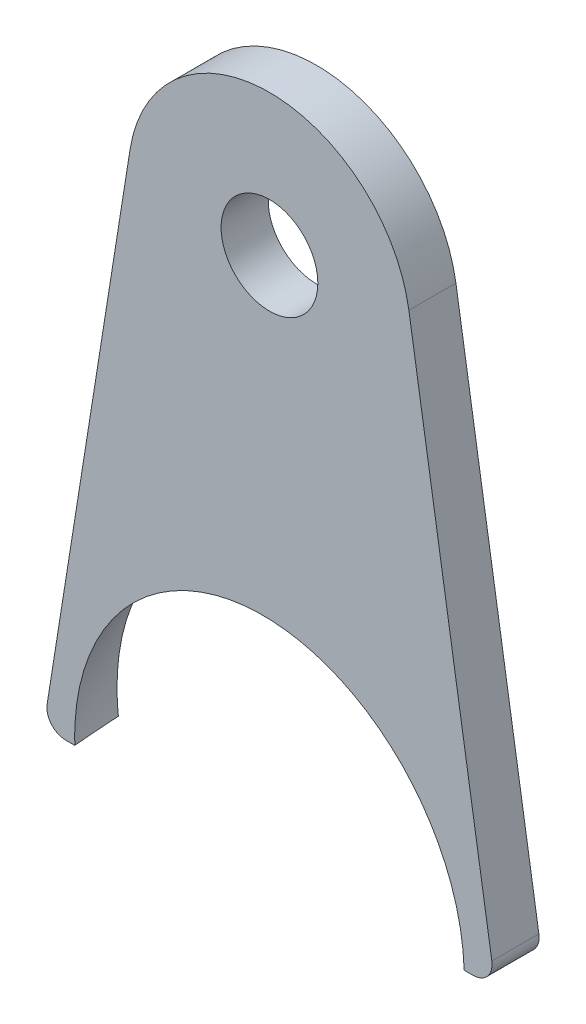
ISO-10303-21;
HEADER;
FILE_DESCRIPTION(('STEP AP214'),'2;1');
FILE_NAME('part.step','',(''),(''),'','','');
FILE_SCHEMA(('AUTOMOTIVE_DESIGN { 1 0 10303 214 1 1 1 1 }'));
ENDSEC;
DATA;
#1=APPLICATION_CONTEXT('core data for automotive mechanical design processes');
#2=APPLICATION_PROTOCOL_DEFINITION('international standard','automotive_design',2000,#1);
#3=PRODUCT_CONTEXT('',#1,'mechanical');
#4=PRODUCT('Part','Part','',(#3));
#5=PRODUCT_RELATED_PRODUCT_CATEGORY('part','',(#4));
#6=PRODUCT_DEFINITION_FORMATION('','',#4);
#7=PRODUCT_DEFINITION_CONTEXT('part definition',#1,'design');
#8=PRODUCT_DEFINITION('design','',#6,#7);
#9=PRODUCT_DEFINITION_SHAPE('','',#8);
#10=(LENGTH_UNIT() NAMED_UNIT(*) SI_UNIT(.MILLI.,.METRE.));
#11=(NAMED_UNIT(*) PLANE_ANGLE_UNIT() SI_UNIT($,.RADIAN.));
#12=(NAMED_UNIT(*) SI_UNIT($,.STERADIAN.) SOLID_ANGLE_UNIT());
#13=UNCERTAINTY_MEASURE_WITH_UNIT(LENGTH_MEASURE(1.E-05),#10,'distance_accuracy_value','');
#14=(GEOMETRIC_REPRESENTATION_CONTEXT(3) GLOBAL_UNCERTAINTY_ASSIGNED_CONTEXT((#13)) GLOBAL_UNIT_ASSIGNED_CONTEXT((#10,
#11,#12)) REPRESENTATION_CONTEXT('',''));
#15=CARTESIAN_POINT('',(0.,0.,0.));
#16=DIRECTION('',(0.,0.,1.));
#17=DIRECTION('',(1.,0.,0.));
#18=AXIS2_PLACEMENT_3D('',#15,#16,#17);
#19=CARTESIAN_POINT('',(0.,-35.211766,-3.175));
#20=DIRECTION('',(0.,1.,0.));
#21=DIRECTION('',(-1.,0.,0.));
#22=AXIS2_PLACEMENT_3D('',#19,#20,#21);
#23=PLANE('',#22);
#24=DIRECTION('',(1.,0.,0.));
#25=VECTOR('',#24,1.);
#26=CARTESIAN_POINT('',(0.,-35.211766,0.));
#27=LINE('',#26,#25);
#28=CARTESIAN_POINT('',(13.1394340026449,-35.211766,0.));
#29=VERTEX_POINT('',#28);
#30=CARTESIAN_POINT('',(13.7522496650488,-35.211766,0.));
#31=VERTEX_POINT('',#30);
#32=EDGE_CURVE('E133',#29,#31,#27,.T.);
#33=ORIENTED_EDGE('',*,*,#32,.F.);
#34=CARTESIAN_POINT('',(0.00476535947653567,-35.211766,0.0475119253615652));
#35=DIRECTION('',(0.,-1.,0.));
#36=DIRECTION('',(0.0997974651312011,0.,0.995007771805521));
#37=AXIS2_PLACEMENT_3D('',#34,#35,#36);
#38=ELLIPSE('',#37,38.1911531206199,13.081);
#39=CARTESIAN_POINT('',(12.8114151936816,-35.211766,-3.175));
#40=VERTEX_POINT('',#39);
#41=EDGE_CURVE('E116',#29,#40,#38,.F.);
#42=ORIENTED_EDGE('',*,*,#41,.T.);
#43=DIRECTION('',(1.,0.,0.));
#44=VECTOR('',#43,1.);
#45=CARTESIAN_POINT('',(0.,-35.211766,-3.175));
#46=LINE('',#45,#44);
#47=CARTESIAN_POINT('',(13.7522496650488,-35.211766,-3.175));
#48=VERTEX_POINT('',#47);
#49=EDGE_CURVE('E180',#40,#48,#46,.T.);
#50=ORIENTED_EDGE('',*,*,#49,.T.);
#51=DIRECTION('',(0.,0.,1.));
#52=VECTOR('',#51,1.);
#53=CARTESIAN_POINT('',(13.7522496650488,-35.211766,-3.175));
#54=LINE('',#53,#52);
#55=EDGE_CURVE('E11',#31,#48,#54,.F.);
#56=ORIENTED_EDGE('',*,*,#55,.F.);
#57=EDGE_LOOP('',(#33,#42,#50,#56));
#58=FACE_BOUND('',#57,.T.);
#59=ADVANCED_FACE('F45',(#58),#23,.F.);
#60=CARTESIAN_POINT('',(-9.40696698253595,1.49485691271059,-3.175));
#61=DIRECTION('',(-0.987608082156004,0.156940358289825,0.));
#62=DIRECTION('',(-0.156940358289825,-0.987608082156004,0.));
#63=AXIS2_PLACEMENT_3D('',#60,#61,#62);
#64=PLANE('',#63);
#65=DIRECTION('',(0.156940358289825,0.987608082156004,0.));
#66=VECTOR('',#65,1.);
#67=CARTESIAN_POINT('',(-9.40696698253595,1.49485691271059,0.));
#68=LINE('',#67,#66);
#69=CARTESIAN_POINT('',(-15.006511929387,-33.7424517449719,0.));
#70=VERTEX_POINT('',#69);
#71=CARTESIAN_POINT('',(-9.40696698253595,1.49485691271059,0.));
#72=VERTEX_POINT('',#71);
#73=EDGE_CURVE('E140',#70,#72,#68,.T.);
#74=ORIENTED_EDGE('',*,*,#73,.T.);
#75=DIRECTION('',(0.,0.,1.));
#76=VECTOR('',#75,1.);
#77=CARTESIAN_POINT('',(-9.40696698253595,1.49485691271059,-3.175));
#78=LINE('',#77,#76);
#79=CARTESIAN_POINT('',(-9.40696698253595,1.49485691271059,-3.175));
#80=VERTEX_POINT('',#79);
#81=EDGE_CURVE('E131',#80,#72,#78,.T.);
#82=ORIENTED_EDGE('',*,*,#81,.F.);
#83=DIRECTION('',(0.156940358289825,0.987608082156004,0.));
#84=VECTOR('',#83,1.);
#85=CARTESIAN_POINT('',(-9.40696698253595,1.49485691271059,-3.175));
#86=LINE('',#85,#84);
#87=CARTESIAN_POINT('',(-15.006511929387,-33.7424517449719,-3.175));
#88=VERTEX_POINT('',#87);
#89=EDGE_CURVE('E181',#88,#80,#86,.T.);
#90=ORIENTED_EDGE('',*,*,#89,.F.);
#91=DIRECTION('',(0.,0.,1.));
#92=VECTOR('',#91,1.);
#93=CARTESIAN_POINT('',(-15.006511929387,-33.7424517449719,-3.175));
#94=LINE('',#93,#92);
#95=EDGE_CURVE('E153',#70,#88,#94,.F.);
#96=ORIENTED_EDGE('',*,*,#95,.F.);
#97=EDGE_LOOP('',(#74,#82,#90,#96));
#98=FACE_BOUND('',#97,.T.);
#99=ADVANCED_FACE('F191',(#98),#64,.T.);
#100=CARTESIAN_POINT('',(-13.7522496650488,-35.211766,-3.175));
#101=VERTEX_POINT('',#100);
#102=CARTESIAN_POINT('',(-13.3718002828243,-35.211766,-3.175));
#103=VERTEX_POINT('',#102);
#104=EDGE_CURVE('E136',#101,#103,#46,.T.);
#105=ORIENTED_EDGE('',*,*,#104,.T.);
#106=CARTESIAN_POINT('',(-13.138305982569,-35.211766,0.));
#107=VERTEX_POINT('',#106);
#108=EDGE_CURVE('E113',#103,#107,#38,.F.);
#109=ORIENTED_EDGE('',*,*,#108,.T.);
#110=CARTESIAN_POINT('',(-13.7522496650488,-35.211766,0.));
#111=VERTEX_POINT('',#110);
#112=EDGE_CURVE('E122',#111,#107,#27,.T.);
#113=ORIENTED_EDGE('',*,*,#112,.F.);
#114=DIRECTION('',(0.,0.,1.));
#115=VECTOR('',#114,1.);
#116=CARTESIAN_POINT('',(-13.7522496650488,-35.211766,0.));
#117=LINE('',#116,#115);
#118=EDGE_CURVE('E144',#101,#111,#117,.T.);
#119=ORIENTED_EDGE('',*,*,#118,.F.);
#120=EDGE_LOOP('',(#105,#109,#113,#119));
#121=FACE_BOUND('',#120,.T.);
#122=ADVANCED_FACE('F134',(#121),#23,.F.);
#123=CARTESIAN_POINT('',(9.40696698253595,1.49485691271059,-3.175));
#124=DIRECTION('',(-0.987608082156004,-0.156940358289826,0.));
#125=DIRECTION('',(0.156940358289826,-0.987608082156004,0.));
#126=AXIS2_PLACEMENT_3D('',#123,#124,#125);
#127=PLANE('',#126);
#128=DIRECTION('',(-0.156940358289826,0.987608082156004,0.));
#129=VECTOR('',#128,1.);
#130=CARTESIAN_POINT('',(9.40696698253595,1.49485691271059,-3.175));
#131=LINE('',#130,#129);
#132=CARTESIAN_POINT('',(15.006511929387,-33.7424517449719,-3.175));
#133=VERTEX_POINT('',#132);
#134=CARTESIAN_POINT('',(9.40696698253595,1.49485691271059,-3.175));
#135=VERTEX_POINT('',#134);
#136=EDGE_CURVE('E178',#133,#135,#131,.T.);
#137=ORIENTED_EDGE('',*,*,#136,.T.);
#138=DIRECTION('',(0.,0.,1.));
#139=VECTOR('',#138,1.);
#140=CARTESIAN_POINT('',(9.40696698253595,1.49485691271059,-3.175));
#141=LINE('',#140,#139);
#142=CARTESIAN_POINT('',(9.40696698253595,1.49485691271059,0.));
#143=VERTEX_POINT('',#142);
#144=EDGE_CURVE('E166',#135,#143,#141,.T.);
#145=ORIENTED_EDGE('',*,*,#144,.T.);
#146=DIRECTION('',(-0.156940358289826,0.987608082156004,0.));
#147=VECTOR('',#146,1.);
#148=CARTESIAN_POINT('',(9.40696698253595,1.49485691271059,0.));
#149=LINE('',#148,#147);
#150=CARTESIAN_POINT('',(15.006511929387,-33.7424517449719,0.));
#151=VERTEX_POINT('',#150);
#152=EDGE_CURVE('E130',#151,#143,#149,.T.);
#153=ORIENTED_EDGE('',*,*,#152,.F.);
#154=DIRECTION('',(0.,0.,1.));
#155=VECTOR('',#154,1.);
#156=CARTESIAN_POINT('',(15.006511929387,-33.7424517449719,-3.175));
#157=LINE('',#156,#155);
#158=EDGE_CURVE('E53',#133,#151,#157,.T.);
#159=ORIENTED_EDGE('',*,*,#158,.F.);
#160=EDGE_LOOP('',(#137,#145,#153,#159));
#161=FACE_BOUND('',#160,.T.);
#162=ADVANCED_FACE('F164',(#161),#127,.F.);
#163=CARTESIAN_POINT('',(0.,0.,-3.175));
#164=DIRECTION('',(0.,0.,1.));
#165=DIRECTION('',(-1.,0.,0.));
#166=AXIS2_PLACEMENT_3D('',#163,#164,#165);
#167=CYLINDRICAL_SURFACE('',#166,9.525);
#168=CARTESIAN_POINT('',(0.,0.,0.));
#169=DIRECTION('',(0.,0.,1.));
#170=DIRECTION('',(1.,0.,0.));
#171=AXIS2_PLACEMENT_3D('',#168,#169,#170);
#172=CIRCLE('',#171,9.525);
#173=EDGE_CURVE('E167',#143,#72,#172,.T.);
#174=ORIENTED_EDGE('',*,*,#173,.F.);
#175=ORIENTED_EDGE('',*,*,#144,.F.);
#176=CARTESIAN_POINT('',(0.,0.,-3.175));
#177=DIRECTION('',(0.,0.,1.));
#178=DIRECTION('',(1.,0.,0.));
#179=AXIS2_PLACEMENT_3D('',#176,#177,#178);
#180=CIRCLE('',#179,9.525);
#181=EDGE_CURVE('E173',#135,#80,#180,.T.);
#182=ORIENTED_EDGE('',*,*,#181,.T.);
#183=ORIENTED_EDGE('',*,*,#81,.T.);
#184=EDGE_LOOP('',(#174,#175,#182,#183));
#185=FACE_BOUND('',#184,.T.);
#186=ADVANCED_FACE('F196',(#185),#167,.T.);
#187=CARTESIAN_POINT('',(0.,0.,-3.175));
#188=DIRECTION('',(0.,0.,1.));
#189=DIRECTION('',(-1.,0.,0.));
#190=AXIS2_PLACEMENT_3D('',#187,#188,#189);
#191=CYLINDRICAL_SURFACE('',#190,3.2639);
#192=CARTESIAN_POINT('',(0.,0.,-3.175));
#193=DIRECTION('',(0.,0.,1.));
#194=DIRECTION('',(1.,0.,0.));
#195=AXIS2_PLACEMENT_3D('',#192,#193,#194);
#196=CIRCLE('',#195,3.2639);
#197=CARTESIAN_POINT('',(3.2639,0.,-3.175));
#198=VERTEX_POINT('',#197);
#199=EDGE_CURVE('E174',#198,#198,#196,.T.);
#200=ORIENTED_EDGE('',*,*,#199,.F.);
#201=EDGE_LOOP('',(#200));
#202=FACE_BOUND('',#201,.T.);
#203=CARTESIAN_POINT('',(0.,0.,0.));
#204=DIRECTION('',(0.,0.,1.));
#205=DIRECTION('',(1.,0.,0.));
#206=AXIS2_PLACEMENT_3D('',#203,#204,#205);
#207=CIRCLE('',#206,3.2639);
#208=CARTESIAN_POINT('',(3.2639,0.,0.));
#209=VERTEX_POINT('',#208);
#210=EDGE_CURVE('E137',#209,#209,#207,.T.);
#211=ORIENTED_EDGE('',*,*,#210,.T.);
#212=EDGE_LOOP('',(#211));
#213=FACE_BOUND('',#212,.T.);
#214=ADVANCED_FACE('F198',(#202,#213),#191,.F.);
#215=CARTESIAN_POINT('',(0.,0.,-3.175));
#216=DIRECTION('',(0.,0.,-1.));
#217=DIRECTION('',(1.,0.,0.));
#218=AXIS2_PLACEMENT_3D('',#215,#216,#217);
#219=PLANE('',#218);
#220=ORIENTED_EDGE('',*,*,#89,.T.);
#221=ORIENTED_EDGE('',*,*,#181,.F.);
#222=ORIENTED_EDGE('',*,*,#136,.F.);
#223=CARTESIAN_POINT('',(13.7522496650488,-33.941766,-3.175));
#224=DIRECTION('',(0.,0.,1.));
#225=DIRECTION('',(1.,0.,0.));
#226=AXIS2_PLACEMENT_3D('',#223,#224,#225);
#227=CIRCLE('',#226,1.27);
#228=EDGE_CURVE('E59',#48,#133,#227,.T.);
#229=ORIENTED_EDGE('',*,*,#228,.F.);
#230=ORIENTED_EDGE('',*,*,#49,.F.);
#231=CARTESIAN_POINT('',(-0.318446710437847,-34.0310551677843,-3.17500000000004));
#232=DIRECTION('',(0.,0.,1.));
#233=DIRECTION('',(0.264029713718258,-0.964514546429371,0.));
#234=AXIS2_PLACEMENT_3D('',#231,#232,#233);
#235=ELLIPSE('',#234,13.993030663266,13.081);
#236=EDGE_CURVE('E183',#103,#40,#235,.F.);
#237=ORIENTED_EDGE('',*,*,#236,.F.);
#238=ORIENTED_EDGE('',*,*,#104,.F.);
#239=CARTESIAN_POINT('',(-13.7522496650488,-33.941766,-3.175));
#240=DIRECTION('',(0.,0.,1.));
#241=DIRECTION('',(1.,0.,0.));
#242=AXIS2_PLACEMENT_3D('',#239,#240,#241);
#243=CIRCLE('',#242,1.27);
#244=EDGE_CURVE('E157',#88,#101,#243,.T.);
#245=ORIENTED_EDGE('',*,*,#244,.F.);
#246=EDGE_LOOP('',(#220,#221,#222,#229,#230,#237,#238,#245));
#247=FACE_BOUND('',#246,.T.);
#248=ORIENTED_EDGE('',*,*,#199,.T.);
#249=EDGE_LOOP('',(#248));
#250=FACE_BOUND('',#249,.T.);
#251=ADVANCED_FACE('F184',(#247,#250),#219,.T.);
#252=CARTESIAN_POINT('',(0.,0.,0.));
#253=DIRECTION('',(0.,0.,-1.));
#254=DIRECTION('',(1.,0.,0.));
#255=AXIS2_PLACEMENT_3D('',#252,#253,#254);
#256=PLANE('',#255);
#257=ORIENTED_EDGE('',*,*,#112,.T.);
#258=CARTESIAN_POINT('',(0.,-35.1943578891122,0.));
#259=DIRECTION('',(0.,0.,1.));
#260=DIRECTION('',(0.264029713718258,-0.964514546429371,0.));
#261=AXIS2_PLACEMENT_3D('',#258,#259,#260);
#262=ELLIPSE('',#261,13.993030663266,13.081);
#263=EDGE_CURVE('E109',#107,#29,#262,.F.);
#264=ORIENTED_EDGE('',*,*,#263,.T.);
#265=ORIENTED_EDGE('',*,*,#32,.T.);
#266=CARTESIAN_POINT('',(13.7522496650488,-33.941766,0.));
#267=DIRECTION('',(0.,0.,1.));
#268=DIRECTION('',(1.,0.,0.));
#269=AXIS2_PLACEMENT_3D('',#266,#267,#268);
#270=CIRCLE('',#269,1.27);
#271=EDGE_CURVE('E147',#151,#31,#270,.F.);
#272=ORIENTED_EDGE('',*,*,#271,.F.);
#273=ORIENTED_EDGE('',*,*,#152,.T.);
#274=ORIENTED_EDGE('',*,*,#173,.T.);
#275=ORIENTED_EDGE('',*,*,#73,.F.);
#276=CARTESIAN_POINT('',(-13.7522496650488,-33.941766,0.));
#277=DIRECTION('',(0.,0.,1.));
#278=DIRECTION('',(1.,0.,0.));
#279=AXIS2_PLACEMENT_3D('',#276,#277,#278);
#280=CIRCLE('',#279,1.27);
#281=EDGE_CURVE('E126',#111,#70,#280,.F.);
#282=ORIENTED_EDGE('',*,*,#281,.F.);
#283=EDGE_LOOP('',(#257,#264,#265,#272,#273,#274,#275,#282));
#284=FACE_BOUND('',#283,.T.);
#285=ORIENTED_EDGE('',*,*,#210,.F.);
#286=EDGE_LOOP('',(#285));
#287=FACE_BOUND('',#286,.T.);
#288=ADVANCED_FACE('F123',(#284,#287),#256,.F.);
#289=CARTESIAN_POINT('',(-68.993899624546,216.84401637422,-687.887876143363));
#290=DIRECTION('',(0.0937609927810821,-0.342513879030728,0.934822506631088));
#291=DIRECTION('',(0.902184120214345,-0.367856186909637,-0.225267927112072));
#292=AXIS2_PLACEMENT_3D('',#289,#290,#291);
#293=CYLINDRICAL_SURFACE('',#292,13.081);
#294=ORIENTED_EDGE('',*,*,#108,.F.);
#295=ORIENTED_EDGE('',*,*,#236,.T.);
#296=ORIENTED_EDGE('',*,*,#41,.F.);
#297=ORIENTED_EDGE('',*,*,#263,.F.);
#298=EDGE_LOOP('',(#294,#295,#296,#297));
#299=FACE_BOUND('',#298,.T.);
#300=ADVANCED_FACE('F111',(#299),#293,.F.);
#301=CARTESIAN_POINT('',(-13.7522496650488,-33.941766,-3.175));
#302=DIRECTION('',(0.,0.,-1.));
#303=DIRECTION('',(1.,0.,0.));
#304=AXIS2_PLACEMENT_3D('',#301,#302,#303);
#305=CYLINDRICAL_SURFACE('',#304,1.27);
#306=ORIENTED_EDGE('',*,*,#244,.T.);
#307=ORIENTED_EDGE('',*,*,#118,.T.);
#308=ORIENTED_EDGE('',*,*,#281,.T.);
#309=ORIENTED_EDGE('',*,*,#95,.T.);
#310=EDGE_LOOP('',(#306,#307,#308,#309));
#311=FACE_BOUND('',#310,.T.);
#312=ADVANCED_FACE('F189',(#311),#305,.T.);
#313=CARTESIAN_POINT('',(13.7522496650488,-33.941766,-3.175));
#314=DIRECTION('',(0.,0.,1.));
#315=DIRECTION('',(-1.,0.,0.));
#316=AXIS2_PLACEMENT_3D('',#313,#314,#315);
#317=CYLINDRICAL_SURFACE('',#316,1.27);
#318=ORIENTED_EDGE('',*,*,#228,.T.);
#319=ORIENTED_EDGE('',*,*,#158,.T.);
#320=ORIENTED_EDGE('',*,*,#271,.T.);
#321=ORIENTED_EDGE('',*,*,#55,.T.);
#322=EDGE_LOOP('',(#318,#319,#320,#321));
#323=FACE_BOUND('',#322,.T.);
#324=ADVANCED_FACE('F47',(#323),#317,.T.);
#325=CLOSED_SHELL('',(#59,#99,#122,#162,#186,#214,#251,#288,#300,#312,#324));
#326=MANIFOLD_SOLID_BREP('B2',#325);
#327=ADVANCED_BREP_SHAPE_REPRESENTATION('',(#18,#326),#14);
#328=SHAPE_DEFINITION_REPRESENTATION(#9,#327);
ENDSEC;
END-ISO-10303-21;
